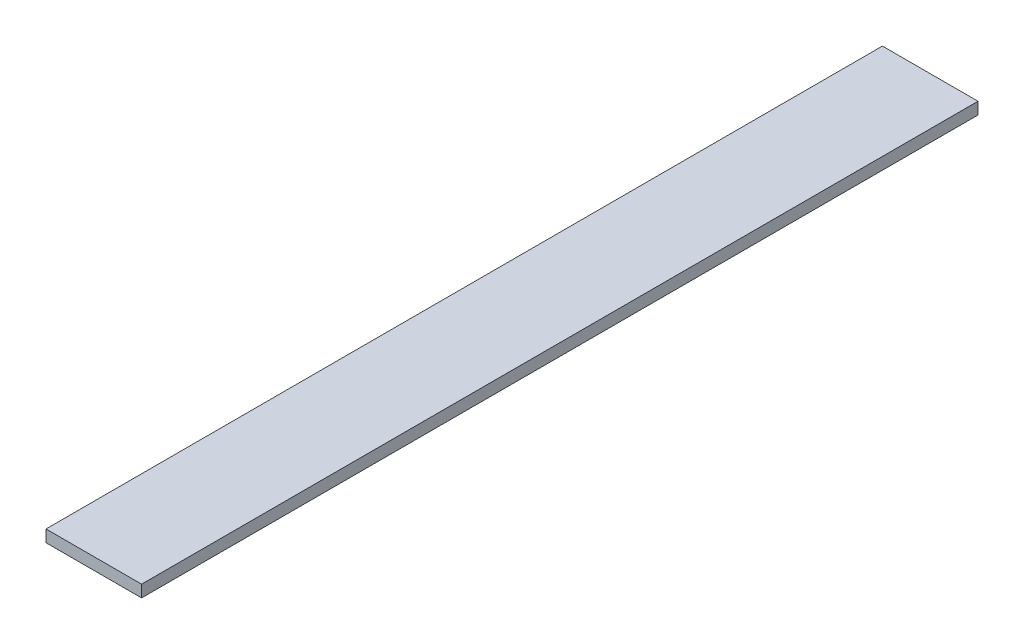
ISO-10303-21;
HEADER;
FILE_DESCRIPTION(('STEP AP214'),'2;1');
FILE_NAME('part.step','',(''),(''),'','','');
FILE_SCHEMA(('AUTOMOTIVE_DESIGN { 1 0 10303 214 1 1 1 1 }'));
ENDSEC;
DATA;
#1=APPLICATION_CONTEXT('core data for automotive mechanical design processes');
#2=APPLICATION_PROTOCOL_DEFINITION('international standard','automotive_design',2000,#1);
#3=PRODUCT_CONTEXT('',#1,'mechanical');
#4=PRODUCT('Part','Part','',(#3));
#5=PRODUCT_RELATED_PRODUCT_CATEGORY('part','',(#4));
#6=PRODUCT_DEFINITION_FORMATION('','',#4);
#7=PRODUCT_DEFINITION_CONTEXT('part definition',#1,'design');
#8=PRODUCT_DEFINITION('design','',#6,#7);
#9=PRODUCT_DEFINITION_SHAPE('','',#8);
#10=(LENGTH_UNIT() NAMED_UNIT(*) SI_UNIT(.MILLI.,.METRE.));
#11=(NAMED_UNIT(*) PLANE_ANGLE_UNIT() SI_UNIT($,.RADIAN.));
#12=(NAMED_UNIT(*) SI_UNIT($,.STERADIAN.) SOLID_ANGLE_UNIT());
#13=UNCERTAINTY_MEASURE_WITH_UNIT(LENGTH_MEASURE(1.E-05),#10,'distance_accuracy_value','');
#14=(GEOMETRIC_REPRESENTATION_CONTEXT(3) GLOBAL_UNCERTAINTY_ASSIGNED_CONTEXT((#13)) GLOBAL_UNIT_ASSIGNED_CONTEXT((#10,
#11,#12)) REPRESENTATION_CONTEXT('',''));
#15=CARTESIAN_POINT('',(0.,0.,0.));
#16=DIRECTION('',(0.,0.,1.));
#17=DIRECTION('',(1.,0.,0.));
#18=AXIS2_PLACEMENT_3D('',#15,#16,#17);
#19=CARTESIAN_POINT('',(0.,-20.,-35.));
#20=DIRECTION('',(0.,0.,-1.));
#21=DIRECTION('',(-1.,0.,0.));
#22=AXIS2_PLACEMENT_3D('',#19,#20,#21);
#23=PLANE('',#22);
#24=DIRECTION('',(1.,0.,0.));
#25=VECTOR('',#24,1.);
#26=CARTESIAN_POINT('',(-1.99999999999977,4.99999999999998,-35.));
#27=LINE('',#26,#25);
#28=CARTESIAN_POINT('',(-1.99999999999976,4.99999999999998,-35.));
#29=VERTEX_POINT('',#28);
#30=CARTESIAN_POINT('',(1.99999999999997,4.99999999999998,-35.));
#31=VERTEX_POINT('',#30);
#32=EDGE_CURVE('E45',#29,#31,#27,.T.);
#33=ORIENTED_EDGE('',*,*,#32,.F.);
#34=DIRECTION('',(0.,1.,0.));
#35=VECTOR('',#34,1.);
#36=CARTESIAN_POINT('',(-1.99999999999976,4.99999999999998,-35.));
#37=LINE('',#36,#35);
#38=CARTESIAN_POINT('',(-1.99999999999976,5.49999999999998,-35.));
#39=VERTEX_POINT('',#38);
#40=EDGE_CURVE('E68',#29,#39,#37,.T.);
#41=ORIENTED_EDGE('',*,*,#40,.T.);
#42=DIRECTION('',(1.,0.,0.));
#43=VECTOR('',#42,1.);
#44=CARTESIAN_POINT('',(-1.99999999999977,5.49999999999998,-35.));
#45=LINE('',#44,#43);
#46=CARTESIAN_POINT('',(1.99999999999997,5.49999999999998,-35.));
#47=VERTEX_POINT('',#46);
#48=EDGE_CURVE('E73',#39,#47,#45,.T.);
#49=ORIENTED_EDGE('',*,*,#48,.T.);
#50=DIRECTION('',(0.,1.,0.));
#51=VECTOR('',#50,1.);
#52=CARTESIAN_POINT('',(1.99999999999997,4.99999999999998,-35.));
#53=LINE('',#52,#51);
#54=EDGE_CURVE('E88',#31,#47,#53,.T.);
#55=ORIENTED_EDGE('',*,*,#54,.F.);
#56=EDGE_LOOP('',(#33,#41,#49,#55));
#57=FACE_BOUND('',#56,.T.);
#58=ADVANCED_FACE('F37',(#57),#23,.T.);
#59=CARTESIAN_POINT('',(0.,0.,0.));
#60=DIRECTION('',(0.,0.,1.));
#61=DIRECTION('',(1.,0.,0.));
#62=AXIS2_PLACEMENT_3D('',#59,#60,#61);
#63=PLANE('',#62);
#64=DIRECTION('',(1.,0.,0.));
#65=VECTOR('',#64,1.);
#66=CARTESIAN_POINT('',(-1.99999999999976,4.99999999999998,0.));
#67=LINE('',#66,#65);
#68=CARTESIAN_POINT('',(-1.99999999999976,4.99999999999998,0.));
#69=VERTEX_POINT('',#68);
#70=CARTESIAN_POINT('',(1.99999999999997,4.99999999999998,0.));
#71=VERTEX_POINT('',#70);
#72=EDGE_CURVE('E97',#69,#71,#67,.T.);
#73=ORIENTED_EDGE('',*,*,#72,.T.);
#74=DIRECTION('',(0.,1.,0.));
#75=VECTOR('',#74,1.);
#76=CARTESIAN_POINT('',(1.99999999999997,4.99999999999998,0.));
#77=LINE('',#76,#75);
#78=CARTESIAN_POINT('',(1.99999999999997,5.49999999999998,0.));
#79=VERTEX_POINT('',#78);
#80=EDGE_CURVE('E86',#71,#79,#77,.T.);
#81=ORIENTED_EDGE('',*,*,#80,.T.);
#82=DIRECTION('',(1.,0.,0.));
#83=VECTOR('',#82,1.);
#84=CARTESIAN_POINT('',(-1.99999999999976,5.49999999999998,0.));
#85=LINE('',#84,#83);
#86=CARTESIAN_POINT('',(-1.99999999999976,5.49999999999998,0.));
#87=VERTEX_POINT('',#86);
#88=EDGE_CURVE('E90',#87,#79,#85,.T.);
#89=ORIENTED_EDGE('',*,*,#88,.F.);
#90=DIRECTION('',(0.,1.,0.));
#91=VECTOR('',#90,1.);
#92=CARTESIAN_POINT('',(-1.99999999999976,4.99999999999998,0.));
#93=LINE('',#92,#91);
#94=EDGE_CURVE('E104',#69,#87,#93,.T.);
#95=ORIENTED_EDGE('',*,*,#94,.F.);
#96=EDGE_LOOP('',(#73,#81,#89,#95));
#97=FACE_BOUND('',#96,.T.);
#98=ADVANCED_FACE('F96',(#97),#63,.T.);
#99=CARTESIAN_POINT('',(1.99999999999997,4.99999999999998,-39.031128874149));
#100=DIRECTION('',(1.,0.,0.));
#101=DIRECTION('',(0.,0.,-1.));
#102=AXIS2_PLACEMENT_3D('',#99,#100,#101);
#103=PLANE('',#102);
#104=DIRECTION('',(0.,0.,1.));
#105=VECTOR('',#104,1.);
#106=CARTESIAN_POINT('',(1.99999999999997,4.99999999999998,-39.031128874149));
#107=LINE('',#106,#105);
#108=EDGE_CURVE('E11',#31,#71,#107,.T.);
#109=ORIENTED_EDGE('',*,*,#108,.F.);
#110=ORIENTED_EDGE('',*,*,#54,.T.);
#111=DIRECTION('',(0.,0.,1.));
#112=VECTOR('',#111,1.);
#113=CARTESIAN_POINT('',(1.99999999999997,5.49999999999998,-39.031128874149));
#114=LINE('',#113,#112);
#115=EDGE_CURVE('E83',#47,#79,#114,.T.);
#116=ORIENTED_EDGE('',*,*,#115,.T.);
#117=ORIENTED_EDGE('',*,*,#80,.F.);
#118=EDGE_LOOP('',(#109,#110,#116,#117));
#119=FACE_BOUND('',#118,.T.);
#120=ADVANCED_FACE('F84',(#119),#103,.T.);
#121=CARTESIAN_POINT('',(-1.99999999999976,5.49999999999998,-39.031128874149));
#122=DIRECTION('',(0.,-1.,0.));
#123=DIRECTION('',(0.,0.,-1.));
#124=AXIS2_PLACEMENT_3D('',#121,#122,#123);
#125=PLANE('',#124);
#126=ORIENTED_EDGE('',*,*,#48,.F.);
#127=DIRECTION('',(0.,0.,1.));
#128=VECTOR('',#127,1.);
#129=CARTESIAN_POINT('',(-1.99999999999976,5.49999999999998,-39.031128874149));
#130=LINE('',#129,#128);
#131=EDGE_CURVE('E78',#39,#87,#130,.T.);
#132=ORIENTED_EDGE('',*,*,#131,.T.);
#133=ORIENTED_EDGE('',*,*,#88,.T.);
#134=ORIENTED_EDGE('',*,*,#115,.F.);
#135=EDGE_LOOP('',(#126,#132,#133,#134));
#136=FACE_BOUND('',#135,.T.);
#137=ADVANCED_FACE('F91',(#136),#125,.F.);
#138=CARTESIAN_POINT('',(-1.99999999999976,4.99999999999998,-39.031128874149));
#139=DIRECTION('',(1.,0.,0.));
#140=DIRECTION('',(0.,0.,-1.));
#141=AXIS2_PLACEMENT_3D('',#138,#139,#140);
#142=PLANE('',#141);
#143=ORIENTED_EDGE('',*,*,#40,.F.);
#144=DIRECTION('',(0.,0.,1.));
#145=VECTOR('',#144,1.);
#146=CARTESIAN_POINT('',(-1.99999999999976,4.99999999999998,-39.031128874149));
#147=LINE('',#146,#145);
#148=EDGE_CURVE('E94',#29,#69,#147,.T.);
#149=ORIENTED_EDGE('',*,*,#148,.T.);
#150=ORIENTED_EDGE('',*,*,#94,.T.);
#151=ORIENTED_EDGE('',*,*,#131,.F.);
#152=EDGE_LOOP('',(#143,#149,#150,#151));
#153=FACE_BOUND('',#152,.T.);
#154=ADVANCED_FACE('F110',(#153),#142,.F.);
#155=CARTESIAN_POINT('',(-1.99999999999976,4.99999999999998,-39.031128874149));
#156=DIRECTION('',(0.,-1.,0.));
#157=DIRECTION('',(0.,0.,-1.));
#158=AXIS2_PLACEMENT_3D('',#155,#156,#157);
#159=PLANE('',#158);
#160=ORIENTED_EDGE('',*,*,#148,.F.);
#161=ORIENTED_EDGE('',*,*,#32,.T.);
#162=ORIENTED_EDGE('',*,*,#108,.T.);
#163=ORIENTED_EDGE('',*,*,#72,.F.);
#164=EDGE_LOOP('',(#160,#161,#162,#163));
#165=FACE_BOUND('',#164,.T.);
#166=ADVANCED_FACE('F111',(#165),#159,.T.);
#167=CLOSED_SHELL('',(#58,#98,#120,#137,#154,#166));
#168=MANIFOLD_SOLID_BREP('B2',#167);
#169=ADVANCED_BREP_SHAPE_REPRESENTATION('',(#18,#168),#14);
#170=SHAPE_DEFINITION_REPRESENTATION(#9,#169);
ENDSEC;
END-ISO-10303-21;
